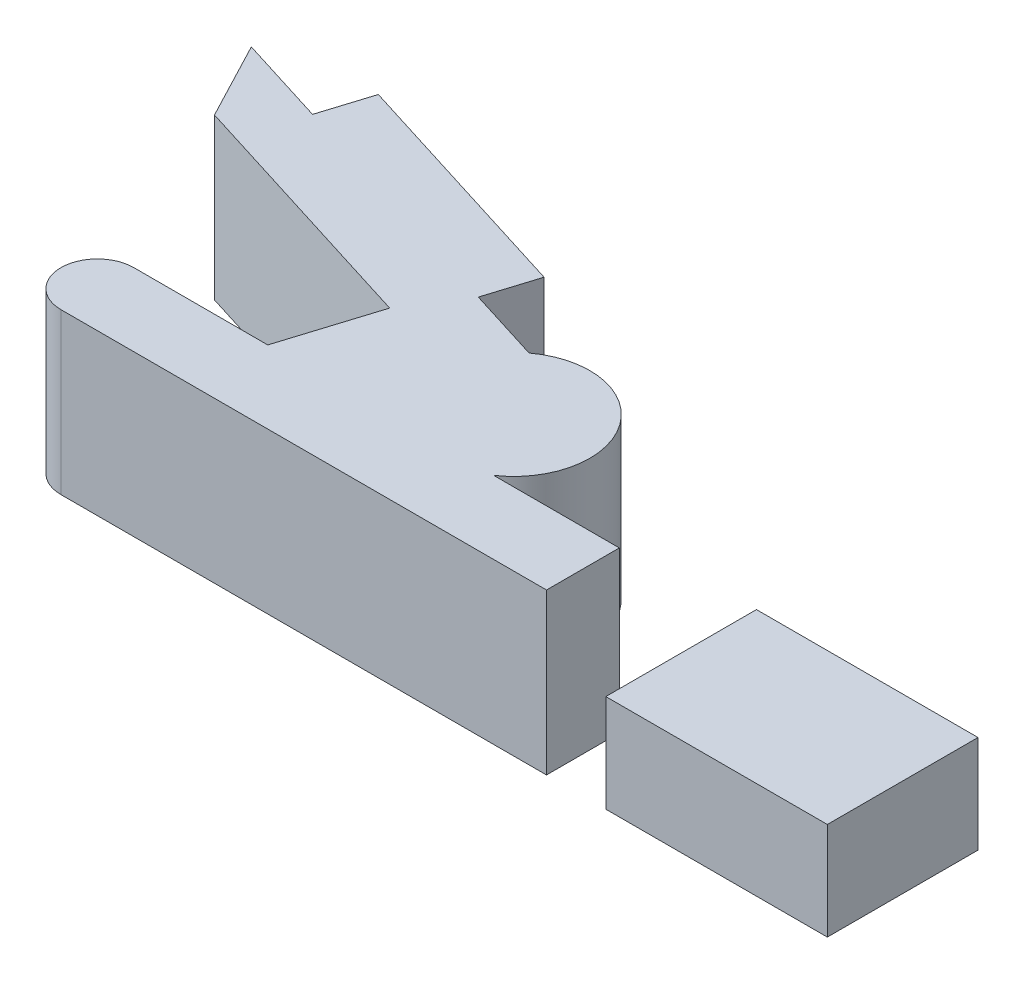
ISO-10303-21;
HEADER;
FILE_DESCRIPTION(('STEP AP214'),'2;1');
FILE_NAME('part.step','',(''),(''),'','','');
FILE_SCHEMA(('AUTOMOTIVE_DESIGN { 1 0 10303 214 1 1 1 1 }'));
ENDSEC;
DATA;
#1=APPLICATION_CONTEXT('core data for automotive mechanical design processes');
#2=APPLICATION_PROTOCOL_DEFINITION('international standard','automotive_design',2000,#1);
#3=PRODUCT_CONTEXT('',#1,'mechanical');
#4=PRODUCT('Part','Part','',(#3));
#5=PRODUCT_RELATED_PRODUCT_CATEGORY('part','',(#4));
#6=PRODUCT_DEFINITION_FORMATION('','',#4);
#7=PRODUCT_DEFINITION_CONTEXT('part definition',#1,'design');
#8=PRODUCT_DEFINITION('design','',#6,#7);
#9=PRODUCT_DEFINITION_SHAPE('','',#8);
#10=(LENGTH_UNIT() NAMED_UNIT(*) SI_UNIT(.MILLI.,.METRE.));
#11=(NAMED_UNIT(*) PLANE_ANGLE_UNIT() SI_UNIT($,.RADIAN.));
#12=(NAMED_UNIT(*) SI_UNIT($,.STERADIAN.) SOLID_ANGLE_UNIT());
#13=UNCERTAINTY_MEASURE_WITH_UNIT(LENGTH_MEASURE(1.E-05),#10,'distance_accuracy_value','');
#14=(GEOMETRIC_REPRESENTATION_CONTEXT(3) GLOBAL_UNCERTAINTY_ASSIGNED_CONTEXT((#13)) GLOBAL_UNIT_ASSIGNED_CONTEXT((#10,
#11,#12)) REPRESENTATION_CONTEXT('',''));
#15=CARTESIAN_POINT('',(0.,0.,0.));
#16=DIRECTION('',(0.,0.,1.));
#17=DIRECTION('',(1.,0.,0.));
#18=AXIS2_PLACEMENT_3D('',#15,#16,#17);
#19=CARTESIAN_POINT('',(50.8496271825024,33.,-13.5371169075047));
#20=DIRECTION('',(1.,0.,0.));
#21=DIRECTION('',(0.,0.,-1.));
#22=AXIS2_PLACEMENT_3D('',#19,#20,#21);
#23=PLANE('',#22);
#24=DIRECTION('',(0.,-1.,0.));
#25=VECTOR('',#24,1.);
#26=CARTESIAN_POINT('',(50.8496271825024,33.,17.4925821686747));
#27=LINE('',#26,#25);
#28=CARTESIAN_POINT('',(50.8496271825024,20.0948984696652,17.4925821686747));
#29=VERTEX_POINT('',#28);
#30=CARTESIAN_POINT('',(50.8496271825024,0.,17.4925821686747));
#31=VERTEX_POINT('',#30);
#32=EDGE_CURVE('E52',#29,#31,#27,.T.);
#33=ORIENTED_EDGE('',*,*,#32,.F.);
#34=DIRECTION('',(0.,0.,1.));
#35=VECTOR('',#34,1.);
#36=CARTESIAN_POINT('',(50.8496271825024,20.0948984696652,-15.5074178313253));
#37=LINE('',#36,#35);
#38=CARTESIAN_POINT('',(50.8496271825024,20.0948984696652,-13.5371169075047));
#39=VERTEX_POINT('',#38);
#40=EDGE_CURVE('E83',#39,#29,#37,.T.);
#41=ORIENTED_EDGE('',*,*,#40,.F.);
#42=DIRECTION('',(0.,-1.,0.));
#43=VECTOR('',#42,1.);
#44=CARTESIAN_POINT('',(50.8496271825024,33.,-13.5371169075047));
#45=LINE('',#44,#43);
#46=CARTESIAN_POINT('',(50.8496271825024,0.,-13.5371169075047));
#47=VERTEX_POINT('',#46);
#48=EDGE_CURVE('E66',#39,#47,#45,.T.);
#49=ORIENTED_EDGE('',*,*,#48,.T.);
#50=DIRECTION('',(0.,0.,1.));
#51=VECTOR('',#50,1.);
#52=CARTESIAN_POINT('',(50.8496271825024,0.,-13.5371169075047));
#53=LINE('',#52,#51);
#54=EDGE_CURVE('E97',#47,#31,#53,.T.);
#55=ORIENTED_EDGE('',*,*,#54,.T.);
#56=EDGE_LOOP('',(#33,#41,#49,#55));
#57=FACE_BOUND('',#56,.T.);
#58=ADVANCED_FACE('F45',(#57),#23,.F.);
#59=CARTESIAN_POINT('',(50.8496271825024,33.,17.4925821686747));
#60=DIRECTION('',(0.,0.,-1.));
#61=DIRECTION('',(-1.,0.,0.));
#62=AXIS2_PLACEMENT_3D('',#59,#60,#61);
#63=PLANE('',#62);
#64=DIRECTION('',(0.,-1.,0.));
#65=VECTOR('',#64,1.);
#66=CARTESIAN_POINT('',(96.4793785701537,33.,17.4925821686747));
#67=LINE('',#66,#65);
#68=CARTESIAN_POINT('',(96.4793785701537,20.0948984696652,17.4925821686747));
#69=VERTEX_POINT('',#68);
#70=CARTESIAN_POINT('',(96.4793785701537,0.,17.4925821686747));
#71=VERTEX_POINT('',#70);
#72=EDGE_CURVE('E94',#69,#71,#67,.T.);
#73=ORIENTED_EDGE('',*,*,#72,.F.);
#74=DIRECTION('',(1.,0.,0.));
#75=VECTOR('',#74,1.);
#76=CARTESIAN_POINT('',(50.8496271825024,20.0948984696652,17.4925821686747));
#77=LINE('',#76,#75);
#78=EDGE_CURVE('E86',#29,#69,#77,.T.);
#79=ORIENTED_EDGE('',*,*,#78,.F.);
#80=ORIENTED_EDGE('',*,*,#32,.T.);
#81=DIRECTION('',(1.,0.,0.));
#82=VECTOR('',#81,1.);
#83=CARTESIAN_POINT('',(50.8496271825024,0.,17.4925821686747));
#84=LINE('',#83,#82);
#85=EDGE_CURVE('E108',#31,#71,#84,.T.);
#86=ORIENTED_EDGE('',*,*,#85,.T.);
#87=EDGE_LOOP('',(#73,#79,#80,#86));
#88=FACE_BOUND('',#87,.T.);
#89=ADVANCED_FACE('F91',(#88),#63,.F.);
#90=CARTESIAN_POINT('',(96.4793785701537,33.,-13.5371169075047));
#91=DIRECTION('',(-1.,0.,0.));
#92=DIRECTION('',(0.,0.,1.));
#93=AXIS2_PLACEMENT_3D('',#90,#91,#92);
#94=PLANE('',#93);
#95=DIRECTION('',(0.,-1.,0.));
#96=VECTOR('',#95,1.);
#97=CARTESIAN_POINT('',(96.4793785701537,33.,-13.5371169075047));
#98=LINE('',#97,#96);
#99=CARTESIAN_POINT('',(96.4793785701537,20.0948984696652,-13.5371169075047));
#100=VERTEX_POINT('',#99);
#101=CARTESIAN_POINT('',(96.4793785701537,0.,-13.5371169075047));
#102=VERTEX_POINT('',#101);
#103=EDGE_CURVE('E98',#100,#102,#98,.T.);
#104=ORIENTED_EDGE('',*,*,#103,.F.);
#105=DIRECTION('',(0.,0.,1.));
#106=VECTOR('',#105,1.);
#107=CARTESIAN_POINT('',(96.4793785701537,20.0948984696652,-15.5074178313253));
#108=LINE('',#107,#106);
#109=EDGE_CURVE('E59',#100,#69,#108,.T.);
#110=ORIENTED_EDGE('',*,*,#109,.T.);
#111=ORIENTED_EDGE('',*,*,#72,.T.);
#112=DIRECTION('',(0.,0.,-1.));
#113=VECTOR('',#112,1.);
#114=CARTESIAN_POINT('',(96.4793785701537,0.,-13.5371169075047));
#115=LINE('',#114,#113);
#116=EDGE_CURVE('E105',#71,#102,#115,.T.);
#117=ORIENTED_EDGE('',*,*,#116,.T.);
#118=EDGE_LOOP('',(#104,#110,#111,#117));
#119=FACE_BOUND('',#118,.T.);
#120=ADVANCED_FACE('F113',(#119),#94,.F.);
#121=CARTESIAN_POINT('',(50.8496271825024,33.,-13.5371169075047));
#122=DIRECTION('',(0.,0.,1.));
#123=DIRECTION('',(1.,0.,0.));
#124=AXIS2_PLACEMENT_3D('',#121,#122,#123);
#125=PLANE('',#124);
#126=ORIENTED_EDGE('',*,*,#48,.F.);
#127=DIRECTION('',(1.,0.,0.));
#128=VECTOR('',#127,1.);
#129=CARTESIAN_POINT('',(50.8496271825024,20.0948984696652,-13.5371169075047));
#130=LINE('',#129,#128);
#131=EDGE_CURVE('E12',#39,#100,#130,.T.);
#132=ORIENTED_EDGE('',*,*,#131,.T.);
#133=ORIENTED_EDGE('',*,*,#103,.T.);
#134=DIRECTION('',(-1.,0.,0.));
#135=VECTOR('',#134,1.);
#136=CARTESIAN_POINT('',(50.8496271825024,0.,-13.5371169075047));
#137=LINE('',#136,#135);
#138=EDGE_CURVE('E103',#102,#47,#137,.T.);
#139=ORIENTED_EDGE('',*,*,#138,.T.);
#140=EDGE_LOOP('',(#126,#132,#133,#139));
#141=FACE_BOUND('',#140,.T.);
#142=ADVANCED_FACE('F117',(#141),#125,.F.);
#143=CARTESIAN_POINT('',(0.,0.,0.));
#144=DIRECTION('',(0.,1.,0.));
#145=DIRECTION('',(0.,0.,1.));
#146=AXIS2_PLACEMENT_3D('',#143,#144,#145);
#147=PLANE('',#146);
#148=ORIENTED_EDGE('',*,*,#54,.F.);
#149=ORIENTED_EDGE('',*,*,#138,.F.);
#150=ORIENTED_EDGE('',*,*,#116,.F.);
#151=ORIENTED_EDGE('',*,*,#85,.F.);
#152=EDGE_LOOP('',(#148,#149,#150,#151));
#153=FACE_BOUND('',#152,.T.);
#154=ADVANCED_FACE('F119',(#153),#147,.F.);
#155=CARTESIAN_POINT('',(50.8496271825024,20.0948984696652,-15.5074178313253));
#156=DIRECTION('',(0.,-1.,0.));
#157=DIRECTION('',(0.,0.,-1.));
#158=AXIS2_PLACEMENT_3D('',#155,#156,#157);
#159=PLANE('',#158);
#160=ORIENTED_EDGE('',*,*,#40,.T.);
#161=ORIENTED_EDGE('',*,*,#78,.T.);
#162=ORIENTED_EDGE('',*,*,#109,.F.);
#163=ORIENTED_EDGE('',*,*,#131,.F.);
#164=EDGE_LOOP('',(#160,#161,#162,#163));
#165=FACE_BOUND('',#164,.T.);
#166=ADVANCED_FACE('F85',(#165),#159,.F.);
#167=CLOSED_SHELL('',(#58,#89,#120,#142,#154,#166));
#168=MANIFOLD_SOLID_BREP('B2',#167);
#169=CARTESIAN_POINT('',(-61.3628676075731,33.,9.99258216867471));
#170=DIRECTION('',(0.,-1.,0.));
#171=DIRECTION('',(0.,0.,-1.));
#172=AXIS2_PLACEMENT_3D('',#169,#170,#171);
#173=CYLINDRICAL_SURFACE('',#172,7.5);
#174=CARTESIAN_POINT('',(-61.3628676075731,0.,9.99258216867471));
#175=DIRECTION('',(0.,1.,0.));
#176=DIRECTION('',(0.,0.,1.));
#177=AXIS2_PLACEMENT_3D('',#174,#175,#176);
#178=CIRCLE('',#177,7.5);
#179=CARTESIAN_POINT('',(-61.3628676075731,0.,2.49258216867471));
#180=VERTEX_POINT('',#179);
#181=CARTESIAN_POINT('',(-61.3628676075731,0.,17.4925821686747));
#182=VERTEX_POINT('',#181);
#183=EDGE_CURVE('E301',#180,#182,#178,.T.);
#184=ORIENTED_EDGE('',*,*,#183,.T.);
#185=DIRECTION('',(0.,-1.,0.));
#186=VECTOR('',#185,1.);
#187=CARTESIAN_POINT('',(-61.3628676075731,33.,17.4925821686747));
#188=LINE('',#187,#186);
#189=CARTESIAN_POINT('',(-61.3628676075731,33.,17.4925821686747));
#190=VERTEX_POINT('',#189);
#191=EDGE_CURVE('E43',#190,#182,#188,.T.);
#192=ORIENTED_EDGE('',*,*,#191,.F.);
#193=CARTESIAN_POINT('',(-61.3628676075731,33.,9.99258216867471));
#194=DIRECTION('',(0.,1.,0.));
#195=DIRECTION('',(0.,0.,1.));
#196=AXIS2_PLACEMENT_3D('',#193,#194,#195);
#197=CIRCLE('',#196,7.5);
#198=CARTESIAN_POINT('',(-61.3628676075731,33.,2.49258216867471));
#199=VERTEX_POINT('',#198);
#200=EDGE_CURVE('E327',#199,#190,#197,.T.);
#201=ORIENTED_EDGE('',*,*,#200,.F.);
#202=DIRECTION('',(0.,-1.,0.));
#203=VECTOR('',#202,1.);
#204=CARTESIAN_POINT('',(-61.3628676075731,33.,2.49258216867471));
#205=LINE('',#204,#203);
#206=EDGE_CURVE('E297',#199,#180,#205,.T.);
#207=ORIENTED_EDGE('',*,*,#206,.T.);
#208=EDGE_LOOP('',(#184,#192,#201,#207));
#209=FACE_BOUND('',#208,.T.);
#210=ADVANCED_FACE('F169',(#209),#173,.T.);
#211=CARTESIAN_POINT('',(-61.3628676075731,33.,17.4925821686747));
#212=DIRECTION('',(0.,0.,-1.));
#213=DIRECTION('',(-1.,0.,0.));
#214=AXIS2_PLACEMENT_3D('',#211,#212,#213);
#215=PLANE('',#214);
#216=DIRECTION('',(1.,0.,0.));
#217=VECTOR('',#216,1.);
#218=CARTESIAN_POINT('',(-61.3628676075731,0.,17.4925821686747));
#219=LINE('',#218,#217);
#220=CARTESIAN_POINT('',(38.6371323924269,0.,17.4925821686747));
#221=VERTEX_POINT('',#220);
#222=EDGE_CURVE('E304',#182,#221,#219,.T.);
#223=ORIENTED_EDGE('',*,*,#222,.T.);
#224=DIRECTION('',(0.,-1.,0.));
#225=VECTOR('',#224,1.);
#226=CARTESIAN_POINT('',(38.6371323924269,33.,17.4925821686747));
#227=LINE('',#226,#225);
#228=CARTESIAN_POINT('',(38.6371323924269,33.,17.4925821686747));
#229=VERTEX_POINT('',#228);
#230=EDGE_CURVE('E177',#229,#221,#227,.T.);
#231=ORIENTED_EDGE('',*,*,#230,.F.);
#232=DIRECTION('',(1.,0.,0.));
#233=VECTOR('',#232,1.);
#234=CARTESIAN_POINT('',(-61.3628676075731,33.,17.4925821686747));
#235=LINE('',#234,#233);
#236=EDGE_CURVE('E246',#190,#229,#235,.T.);
#237=ORIENTED_EDGE('',*,*,#236,.F.);
#238=ORIENTED_EDGE('',*,*,#191,.T.);
#239=EDGE_LOOP('',(#223,#231,#237,#238));
#240=FACE_BOUND('',#239,.T.);
#241=ADVANCED_FACE('F415',(#240),#215,.F.);
#242=CARTESIAN_POINT('',(38.6371323924269,33.,2.49258216867471));
#243=DIRECTION('',(-1.,0.,0.));
#244=DIRECTION('',(0.,0.,1.));
#245=AXIS2_PLACEMENT_3D('',#242,#243,#244);
#246=PLANE('',#245);
#247=DIRECTION('',(0.,0.,-1.));
#248=VECTOR('',#247,1.);
#249=CARTESIAN_POINT('',(38.6371323924269,0.,2.49258216867471));
#250=LINE('',#249,#248);
#251=CARTESIAN_POINT('',(38.6371323924269,0.,2.49258216867471));
#252=VERTEX_POINT('',#251);
#253=EDGE_CURVE('E306',#221,#252,#250,.T.);
#254=ORIENTED_EDGE('',*,*,#253,.T.);
#255=DIRECTION('',(0.,-1.,0.));
#256=VECTOR('',#255,1.);
#257=CARTESIAN_POINT('',(38.6371323924269,33.,2.49258216867471));
#258=LINE('',#257,#256);
#259=CARTESIAN_POINT('',(38.6371323924269,33.,2.49258216867471));
#260=VERTEX_POINT('',#259);
#261=EDGE_CURVE('E352',#260,#252,#258,.T.);
#262=ORIENTED_EDGE('',*,*,#261,.F.);
#263=DIRECTION('',(0.,0.,-1.));
#264=VECTOR('',#263,1.);
#265=CARTESIAN_POINT('',(38.6371323924269,33.,2.49258216867471));
#266=LINE('',#265,#264);
#267=EDGE_CURVE('E360',#229,#260,#266,.T.);
#268=ORIENTED_EDGE('',*,*,#267,.F.);
#269=ORIENTED_EDGE('',*,*,#230,.T.);
#270=EDGE_LOOP('',(#254,#262,#268,#269));
#271=FACE_BOUND('',#270,.T.);
#272=ADVANCED_FACE('F358',(#271),#246,.F.);
#273=CARTESIAN_POINT('',(12.7438243108236,33.,2.49258216867471));
#274=DIRECTION('',(0.,0.,1.));
#275=DIRECTION('',(1.,0.,0.));
#276=AXIS2_PLACEMENT_3D('',#273,#274,#275);
#277=PLANE('',#276);
#278=DIRECTION('',(-1.,0.,0.));
#279=VECTOR('',#278,1.);
#280=CARTESIAN_POINT('',(12.7438243108236,0.,2.49258216867471));
#281=LINE('',#280,#279);
#282=CARTESIAN_POINT('',(12.7438243108236,0.,2.49258216867471));
#283=VERTEX_POINT('',#282);
#284=EDGE_CURVE('E308',#252,#283,#281,.T.);
#285=ORIENTED_EDGE('',*,*,#284,.T.);
#286=DIRECTION('',(0.,-1.,0.));
#287=VECTOR('',#286,1.);
#288=CARTESIAN_POINT('',(12.7438243108236,33.,2.49258216867471));
#289=LINE('',#288,#287);
#290=CARTESIAN_POINT('',(12.7438243108236,33.,2.49258216867471));
#291=VERTEX_POINT('',#290);
#292=EDGE_CURVE('E349',#291,#283,#289,.T.);
#293=ORIENTED_EDGE('',*,*,#292,.F.);
#294=DIRECTION('',(-1.,0.,0.));
#295=VECTOR('',#294,1.);
#296=CARTESIAN_POINT('',(12.7438243108236,33.,2.49258216867471));
#297=LINE('',#296,#295);
#298=EDGE_CURVE('E378',#260,#291,#297,.T.);
#299=ORIENTED_EDGE('',*,*,#298,.F.);
#300=ORIENTED_EDGE('',*,*,#261,.T.);
#301=EDGE_LOOP('',(#285,#293,#299,#300));
#302=FACE_BOUND('',#301,.T.);
#303=ADVANCED_FACE('F369',(#302),#277,.F.);
#304=CARTESIAN_POINT('',(3.96573464463204,33.,-10.4606737751247));
#305=DIRECTION('',(0.,-1.,0.));
#306=DIRECTION('',(0.,0.,-1.));
#307=AXIS2_PLACEMENT_3D('',#304,#305,#306);
#308=CYLINDRICAL_SURFACE('',#307,15.6474182449782);
#309=CARTESIAN_POINT('',(3.96573464463204,0.,-10.4606737751247));
#310=DIRECTION('',(0.,1.,0.));
#311=DIRECTION('',(0.,0.,1.));
#312=AXIS2_PLACEMENT_3D('',#309,#310,#311);
#313=CIRCLE('',#312,15.6474182449782);
#314=CARTESIAN_POINT('',(-5.42415275085064,0.,-22.9775309059476));
#315=VERTEX_POINT('',#314);
#316=EDGE_CURVE('E310',#283,#315,#313,.T.);
#317=ORIENTED_EDGE('',*,*,#316,.T.);
#318=DIRECTION('',(0.,-1.,0.));
#319=VECTOR('',#318,1.);
#320=CARTESIAN_POINT('',(-5.42415275085064,33.,-22.9775309059476));
#321=LINE('',#320,#319);
#322=CARTESIAN_POINT('',(-5.42415275085064,33.,-22.9775309059476));
#323=VERTEX_POINT('',#322);
#324=EDGE_CURVE('E346',#323,#315,#321,.T.);
#325=ORIENTED_EDGE('',*,*,#324,.F.);
#326=CARTESIAN_POINT('',(3.96573464463204,33.,-10.4606737751247));
#327=DIRECTION('',(0.,1.,0.));
#328=DIRECTION('',(0.,0.,1.));
#329=AXIS2_PLACEMENT_3D('',#326,#327,#328);
#330=CIRCLE('',#329,15.6474182449782);
#331=EDGE_CURVE('E375',#291,#323,#330,.T.);
#332=ORIENTED_EDGE('',*,*,#331,.F.);
#333=ORIENTED_EDGE('',*,*,#292,.T.);
#334=EDGE_LOOP('',(#317,#325,#332,#333));
#335=FACE_BOUND('',#334,.T.);
#336=ADVANCED_FACE('F373',(#335),#308,.T.);
#337=CARTESIAN_POINT('',(-20.6305523680841,33.,-27.7295307863327));
#338=DIRECTION('',(-0.298274993135931,0.,0.954479978035035));
#339=DIRECTION('',(0.954479978035035,0.,0.298274993135931));
#340=AXIS2_PLACEMENT_3D('',#337,#338,#339);
#341=PLANE('',#340);
#342=DIRECTION('',(-0.954479978035035,0.,-0.298274993135931));
#343=VECTOR('',#342,1.);
#344=CARTESIAN_POINT('',(-20.6305523680841,0.,-27.7295307863327));
#345=LINE('',#344,#343);
#346=CARTESIAN_POINT('',(-20.6305523680841,0.,-27.7295307863327));
#347=VERTEX_POINT('',#346);
#348=EDGE_CURVE('E312',#315,#347,#345,.T.);
#349=ORIENTED_EDGE('',*,*,#348,.T.);
#350=DIRECTION('',(0.,-1.,0.));
#351=VECTOR('',#350,1.);
#352=CARTESIAN_POINT('',(-20.6305523680841,33.,-27.7295307863327));
#353=LINE('',#352,#351);
#354=CARTESIAN_POINT('',(-20.6305523680841,33.,-27.7295307863327));
#355=VERTEX_POINT('',#354);
#356=EDGE_CURVE('E343',#355,#347,#353,.T.);
#357=ORIENTED_EDGE('',*,*,#356,.F.);
#358=DIRECTION('',(-0.954479978035035,0.,-0.298274993135931));
#359=VECTOR('',#358,1.);
#360=CARTESIAN_POINT('',(-20.6305523680841,33.,-27.7295307863327));
#361=LINE('',#360,#359);
#362=EDGE_CURVE('E377',#323,#355,#361,.T.);
#363=ORIENTED_EDGE('',*,*,#362,.F.);
#364=ORIENTED_EDGE('',*,*,#324,.T.);
#365=EDGE_LOOP('',(#349,#357,#363,#364));
#366=FACE_BOUND('',#365,.T.);
#367=ADVANCED_FACE('F428',(#366),#341,.F.);
#368=CARTESIAN_POINT('',(-17.4061050123375,33.,-38.0477623247223));
#369=DIRECTION('',(-0.954479978035035,0.,-0.298274993135931));
#370=DIRECTION('',(-0.298274993135931,0.,0.954479978035035));
#371=AXIS2_PLACEMENT_3D('',#368,#369,#370);
#372=PLANE('',#371);
#373=DIRECTION('',(0.298274993135931,0.,-0.954479978035035));
#374=VECTOR('',#373,1.);
#375=CARTESIAN_POINT('',(-17.4061050123375,0.,-38.0477623247223));
#376=LINE('',#375,#374);
#377=CARTESIAN_POINT('',(-17.4061050123375,0.,-38.0477623247223));
#378=VERTEX_POINT('',#377);
#379=EDGE_CURVE('E314',#347,#378,#376,.T.);
#380=ORIENTED_EDGE('',*,*,#379,.T.);
#381=DIRECTION('',(0.,-1.,0.));
#382=VECTOR('',#381,1.);
#383=CARTESIAN_POINT('',(-17.4061050123375,33.,-38.0477623247223));
#384=LINE('',#383,#382);
#385=CARTESIAN_POINT('',(-17.4061050123375,33.,-38.0477623247223));
#386=VERTEX_POINT('',#385);
#387=EDGE_CURVE('E340',#386,#378,#384,.T.);
#388=ORIENTED_EDGE('',*,*,#387,.F.);
#389=DIRECTION('',(0.298274993135931,0.,-0.954479978035035));
#390=VECTOR('',#389,1.);
#391=CARTESIAN_POINT('',(-17.4061050123375,33.,-38.0477623247223));
#392=LINE('',#391,#390);
#393=EDGE_CURVE('E380',#355,#386,#392,.T.);
#394=ORIENTED_EDGE('',*,*,#393,.F.);
#395=ORIENTED_EDGE('',*,*,#356,.T.);
#396=EDGE_LOOP('',(#380,#388,#394,#395));
#397=FACE_BOUND('',#396,.T.);
#398=ADVANCED_FACE('F431',(#397),#372,.F.);
#399=CARTESIAN_POINT('',(-67.0632695677719,33.,-53.5656262482947));
#400=DIRECTION('',(-0.298274993135931,0.,0.954479978035035));
#401=DIRECTION('',(0.954479978035035,0.,0.298274993135931));
#402=AXIS2_PLACEMENT_3D('',#399,#400,#401);
#403=PLANE('',#402);
#404=DIRECTION('',(-0.954479978035035,0.,-0.298274993135931));
#405=VECTOR('',#404,1.);
#406=CARTESIAN_POINT('',(-67.0632695677719,0.,-53.5656262482947));
#407=LINE('',#406,#405);
#408=CARTESIAN_POINT('',(-67.0632695677719,0.,-53.5656262482947));
#409=VERTEX_POINT('',#408);
#410=EDGE_CURVE('E316',#378,#409,#407,.T.);
#411=ORIENTED_EDGE('',*,*,#410,.T.);
#412=DIRECTION('',(0.,-1.,0.));
#413=VECTOR('',#412,1.);
#414=CARTESIAN_POINT('',(-67.0632695677719,33.,-53.5656262482947));
#415=LINE('',#414,#413);
#416=CARTESIAN_POINT('',(-67.0632695677719,33.,-53.5656262482947));
#417=VERTEX_POINT('',#416);
#418=EDGE_CURVE('E337',#417,#409,#415,.T.);
#419=ORIENTED_EDGE('',*,*,#418,.F.);
#420=DIRECTION('',(-0.954479978035035,0.,-0.298274993135931));
#421=VECTOR('',#420,1.);
#422=CARTESIAN_POINT('',(-67.0632695677719,33.,-53.5656262482947));
#423=LINE('',#422,#421);
#424=EDGE_CURVE('E386',#386,#417,#423,.T.);
#425=ORIENTED_EDGE('',*,*,#424,.F.);
#426=ORIENTED_EDGE('',*,*,#387,.T.);
#427=EDGE_LOOP('',(#411,#419,#425,#426));
#428=FACE_BOUND('',#427,.T.);
#429=ADVANCED_FACE('F435',(#428),#403,.F.);
#430=CARTESIAN_POINT('',(-70.2877169235185,33.,-43.2473947099051));
#431=DIRECTION('',(0.954479978035035,0.,0.298274993135931));
#432=DIRECTION('',(0.298274993135931,0.,-0.954479978035035));
#433=AXIS2_PLACEMENT_3D('',#430,#431,#432);
#434=PLANE('',#433);
#435=DIRECTION('',(-0.298274993135931,0.,0.954479978035035));
#436=VECTOR('',#435,1.);
#437=CARTESIAN_POINT('',(-70.2877169235185,0.,-43.2473947099051));
#438=LINE('',#437,#436);
#439=CARTESIAN_POINT('',(-70.2877169235185,0.,-43.2473947099051));
#440=VERTEX_POINT('',#439);
#441=EDGE_CURVE('E318',#409,#440,#438,.T.);
#442=ORIENTED_EDGE('',*,*,#441,.T.);
#443=DIRECTION('',(0.,-1.,0.));
#444=VECTOR('',#443,1.);
#445=CARTESIAN_POINT('',(-70.2877169235185,33.,-43.2473947099051));
#446=LINE('',#445,#444);
#447=CARTESIAN_POINT('',(-70.2877169235185,33.,-43.2473947099051));
#448=VERTEX_POINT('',#447);
#449=EDGE_CURVE('E334',#448,#440,#446,.T.);
#450=ORIENTED_EDGE('',*,*,#449,.F.);
#451=DIRECTION('',(-0.298274993135931,0.,0.954479978035035));
#452=VECTOR('',#451,1.);
#453=CARTESIAN_POINT('',(-70.2877169235185,33.,-43.2473947099051));
#454=LINE('',#453,#452);
#455=EDGE_CURVE('E388',#417,#448,#454,.T.);
#456=ORIENTED_EDGE('',*,*,#455,.F.);
#457=ORIENTED_EDGE('',*,*,#418,.T.);
#458=EDGE_LOOP('',(#442,#450,#456,#457));
#459=FACE_BOUND('',#458,.T.);
#460=ADVANCED_FACE('F439',(#459),#434,.F.);
#461=CARTESIAN_POINT('',(-88.6336406430849,33.,-48.9804958722693));
#462=DIRECTION('',(-0.298274993135931,0.,0.954479978035035));
#463=DIRECTION('',(0.954479978035035,0.,0.298274993135931));
#464=AXIS2_PLACEMENT_3D('',#461,#462,#463);
#465=PLANE('',#464);
#466=DIRECTION('',(-0.954479978035035,0.,-0.298274993135931));
#467=VECTOR('',#466,1.);
#468=CARTESIAN_POINT('',(-88.6336406430849,0.,-48.9804958722693));
#469=LINE('',#468,#467);
#470=CARTESIAN_POINT('',(-88.6336406430849,0.,-48.9804958722693));
#471=VERTEX_POINT('',#470);
#472=EDGE_CURVE('E320',#440,#471,#469,.T.);
#473=ORIENTED_EDGE('',*,*,#472,.T.);
#474=DIRECTION('',(0.,-1.,0.));
#475=VECTOR('',#474,1.);
#476=CARTESIAN_POINT('',(-88.6336406430849,33.,-48.9804958722693));
#477=LINE('',#476,#475);
#478=CARTESIAN_POINT('',(-88.6336406430849,33.,-48.9804958722693));
#479=VERTEX_POINT('',#478);
#480=EDGE_CURVE('E331',#479,#471,#477,.T.);
#481=ORIENTED_EDGE('',*,*,#480,.F.);
#482=DIRECTION('',(-0.954479978035035,0.,-0.298274993135931));
#483=VECTOR('',#482,1.);
#484=CARTESIAN_POINT('',(-88.6336406430849,33.,-48.9804958722693));
#485=LINE('',#484,#483);
#486=EDGE_CURVE('E390',#448,#479,#485,.T.);
#487=ORIENTED_EDGE('',*,*,#486,.F.);
#488=ORIENTED_EDGE('',*,*,#449,.T.);
#489=EDGE_LOOP('',(#473,#481,#487,#488));
#490=FACE_BOUND('',#489,.T.);
#491=ADVANCED_FACE('F396',(#490),#465,.F.);
#492=CARTESIAN_POINT('',(-88.6336406430849,33.,-48.9804958722693));
#493=DIRECTION('',(0.885831535280155,0.,-0.464006994670558));
#494=DIRECTION('',(-0.464006994670558,0.,-0.885831535280155));
#495=AXIS2_PLACEMENT_3D('',#492,#493,#494);
#496=PLANE('',#495);
#497=DIRECTION('',(0.464006994670558,0.,0.885831535280155));
#498=VECTOR('',#497,1.);
#499=CARTESIAN_POINT('',(-88.6336406430849,0.,-48.9804958722693));
#500=LINE('',#499,#498);
#501=CARTESIAN_POINT('',(-80.2845166417334,0.,-33.0412591424164));
#502=VERTEX_POINT('',#501);
#503=EDGE_CURVE('E322',#471,#502,#500,.T.);
#504=ORIENTED_EDGE('',*,*,#503,.T.);
#505=DIRECTION('',(0.,-1.,0.));
#506=VECTOR('',#505,1.);
#507=CARTESIAN_POINT('',(-80.2845166417334,33.,-33.0412591424164));
#508=LINE('',#507,#506);
#509=CARTESIAN_POINT('',(-80.2845166417334,33.,-33.0412591424164));
#510=VERTEX_POINT('',#509);
#511=EDGE_CURVE('E292',#510,#502,#508,.T.);
#512=ORIENTED_EDGE('',*,*,#511,.F.);
#513=DIRECTION('',(0.464006994670558,0.,0.885831535280155));
#514=VECTOR('',#513,1.);
#515=CARTESIAN_POINT('',(-88.6336406430849,33.,-48.9804958722693));
#516=LINE('',#515,#514);
#517=EDGE_CURVE('E283',#479,#510,#516,.T.);
#518=ORIENTED_EDGE('',*,*,#517,.F.);
#519=ORIENTED_EDGE('',*,*,#480,.T.);
#520=EDGE_LOOP('',(#504,#512,#518,#519));
#521=FACE_BOUND('',#520,.T.);
#522=ADVANCED_FACE('F400',(#521),#496,.F.);
#523=CARTESIAN_POINT('',(-80.2845166417334,33.,-33.0412591424164));
#524=DIRECTION('',(0.298274993135931,0.,-0.954479978035034));
#525=DIRECTION('',(-0.954479978035035,0.,-0.298274993135931));
#526=AXIS2_PLACEMENT_3D('',#523,#524,#525);
#527=PLANE('',#526);
#528=DIRECTION('',(0.954479978035035,0.,0.298274993135931));
#529=VECTOR('',#528,1.);
#530=CARTESIAN_POINT('',(-80.2845166417334,0.,-33.0412591424164));
#531=LINE('',#530,#529);
#532=CARTESIAN_POINT('',(-27.7965911825733,0.,-16.6387824364298));
#533=VERTEX_POINT('',#532);
#534=EDGE_CURVE('E291',#502,#533,#531,.T.);
#535=ORIENTED_EDGE('',*,*,#534,.T.);
#536=DIRECTION('',(0.,-1.,0.));
#537=VECTOR('',#536,1.);
#538=CARTESIAN_POINT('',(-27.7965911825733,33.,-16.6387824364298));
#539=LINE('',#538,#537);
#540=CARTESIAN_POINT('',(-27.7965911825733,33.,-16.6387824364298));
#541=VERTEX_POINT('',#540);
#542=EDGE_CURVE('E288',#541,#533,#539,.T.);
#543=ORIENTED_EDGE('',*,*,#542,.F.);
#544=DIRECTION('',(0.954479978035035,0.,0.298274993135931));
#545=VECTOR('',#544,1.);
#546=CARTESIAN_POINT('',(-80.2845166417334,33.,-33.0412591424164));
#547=LINE('',#546,#545);
#548=EDGE_CURVE('E277',#510,#541,#547,.T.);
#549=ORIENTED_EDGE('',*,*,#548,.F.);
#550=ORIENTED_EDGE('',*,*,#511,.T.);
#551=EDGE_LOOP('',(#535,#543,#549,#550));
#552=FACE_BOUND('',#551,.T.);
#553=ADVANCED_FACE('F289',(#552),#527,.F.);
#554=CARTESIAN_POINT('',(-27.7965911825733,33.,-16.6387824364298));
#555=DIRECTION('',(0.954479978035035,0.,0.298274993135931));
#556=DIRECTION('',(0.298274993135931,0.,-0.954479978035035));
#557=AXIS2_PLACEMENT_3D('',#554,#555,#556);
#558=PLANE('',#557);
#559=DIRECTION('',(-0.298274993135931,0.,0.954479978035035));
#560=VECTOR('',#559,1.);
#561=CARTESIAN_POINT('',(-27.7965911825733,0.,-16.6387824364298));
#562=LINE('',#561,#560);
#563=CARTESIAN_POINT('',(-33.7751426216681,0.,2.49258216867471));
#564=VERTEX_POINT('',#563);
#565=EDGE_CURVE('E232',#533,#564,#562,.T.);
#566=ORIENTED_EDGE('',*,*,#565,.T.);
#567=DIRECTION('',(0.,-1.,0.));
#568=VECTOR('',#567,1.);
#569=CARTESIAN_POINT('',(-33.7751426216681,33.,2.49258216867471));
#570=LINE('',#569,#568);
#571=CARTESIAN_POINT('',(-33.7751426216681,33.,2.49258216867471));
#572=VERTEX_POINT('',#571);
#573=EDGE_CURVE('E293',#572,#564,#570,.T.);
#574=ORIENTED_EDGE('',*,*,#573,.F.);
#575=DIRECTION('',(-0.298274993135931,0.,0.954479978035035));
#576=VECTOR('',#575,1.);
#577=CARTESIAN_POINT('',(-27.7965911825733,33.,-16.6387824364298));
#578=LINE('',#577,#576);
#579=EDGE_CURVE('E281',#541,#572,#578,.T.);
#580=ORIENTED_EDGE('',*,*,#579,.F.);
#581=ORIENTED_EDGE('',*,*,#542,.T.);
#582=EDGE_LOOP('',(#566,#574,#580,#581));
#583=FACE_BOUND('',#582,.T.);
#584=ADVANCED_FACE('F295',(#583),#558,.F.);
#585=CARTESIAN_POINT('',(-61.3628676075731,33.,2.49258216867471));
#586=DIRECTION('',(0.,0.,1.));
#587=DIRECTION('',(1.,0.,0.));
#588=AXIS2_PLACEMENT_3D('',#585,#586,#587);
#589=PLANE('',#588);
#590=DIRECTION('',(-1.,0.,0.));
#591=VECTOR('',#590,1.);
#592=CARTESIAN_POINT('',(-61.3628676075731,0.,2.49258216867471));
#593=LINE('',#592,#591);
#594=EDGE_CURVE('E238',#564,#180,#593,.T.);
#595=ORIENTED_EDGE('',*,*,#594,.T.);
#596=ORIENTED_EDGE('',*,*,#206,.F.);
#597=DIRECTION('',(-1.,0.,0.));
#598=VECTOR('',#597,1.);
#599=CARTESIAN_POINT('',(-61.3628676075731,33.,2.49258216867471));
#600=LINE('',#599,#598);
#601=EDGE_CURVE('E185',#572,#199,#600,.T.);
#602=ORIENTED_EDGE('',*,*,#601,.F.);
#603=ORIENTED_EDGE('',*,*,#573,.T.);
#604=EDGE_LOOP('',(#595,#596,#602,#603));
#605=FACE_BOUND('',#604,.T.);
#606=ADVANCED_FACE('F404',(#605),#589,.F.);
#607=CARTESIAN_POINT('',(-61.3628676075731,33.,9.99258216867471));
#608=DIRECTION('',(0.,1.,0.));
#609=DIRECTION('',(0.,0.,1.));
#610=AXIS2_PLACEMENT_3D('',#607,#608,#609);
#611=PLANE('',#610);
#612=ORIENTED_EDGE('',*,*,#200,.T.);
#613=ORIENTED_EDGE('',*,*,#236,.T.);
#614=ORIENTED_EDGE('',*,*,#267,.T.);
#615=ORIENTED_EDGE('',*,*,#298,.T.);
#616=ORIENTED_EDGE('',*,*,#331,.T.);
#617=ORIENTED_EDGE('',*,*,#362,.T.);
#618=ORIENTED_EDGE('',*,*,#393,.T.);
#619=ORIENTED_EDGE('',*,*,#424,.T.);
#620=ORIENTED_EDGE('',*,*,#455,.T.);
#621=ORIENTED_EDGE('',*,*,#486,.T.);
#622=ORIENTED_EDGE('',*,*,#517,.T.);
#623=ORIENTED_EDGE('',*,*,#548,.T.);
#624=ORIENTED_EDGE('',*,*,#579,.T.);
#625=ORIENTED_EDGE('',*,*,#601,.T.);
#626=EDGE_LOOP('',(#612,#613,#614,#615,#616,#617,#618,#619,#620,#621,#622,#623,#624,#625));
#627=FACE_BOUND('',#626,.T.);
#628=ADVANCED_FACE('F279',(#627),#611,.T.);
#629=CARTESIAN_POINT('',(-61.3628676075731,0.,9.99258216867471));
#630=DIRECTION('',(0.,1.,0.));
#631=DIRECTION('',(0.,0.,1.));
#632=AXIS2_PLACEMENT_3D('',#629,#630,#631);
#633=PLANE('',#632);
#634=ORIENTED_EDGE('',*,*,#183,.F.);
#635=ORIENTED_EDGE('',*,*,#594,.F.);
#636=ORIENTED_EDGE('',*,*,#565,.F.);
#637=ORIENTED_EDGE('',*,*,#534,.F.);
#638=ORIENTED_EDGE('',*,*,#503,.F.);
#639=ORIENTED_EDGE('',*,*,#472,.F.);
#640=ORIENTED_EDGE('',*,*,#441,.F.);
#641=ORIENTED_EDGE('',*,*,#410,.F.);
#642=ORIENTED_EDGE('',*,*,#379,.F.);
#643=ORIENTED_EDGE('',*,*,#348,.F.);
#644=ORIENTED_EDGE('',*,*,#316,.F.);
#645=ORIENTED_EDGE('',*,*,#284,.F.);
#646=ORIENTED_EDGE('',*,*,#253,.F.);
#647=ORIENTED_EDGE('',*,*,#222,.F.);
#648=EDGE_LOOP('',(#634,#635,#636,#637,#638,#639,#640,#641,#642,#643,#644,#645,#646,#647));
#649=FACE_BOUND('',#648,.T.);
#650=ADVANCED_FACE('F364',(#649),#633,.F.);
#651=CLOSED_SHELL('',(#210,#241,#272,#303,#336,#367,#398,#429,#460,#491,#522,#553,#584,#606,
#628,#650));
#652=MANIFOLD_SOLID_BREP('B6',#651);
#653=ADVANCED_BREP_SHAPE_REPRESENTATION('',(#18,#168,#652),#14);
#654=SHAPE_DEFINITION_REPRESENTATION(#9,#653);
ENDSEC;
END-ISO-10303-21;
